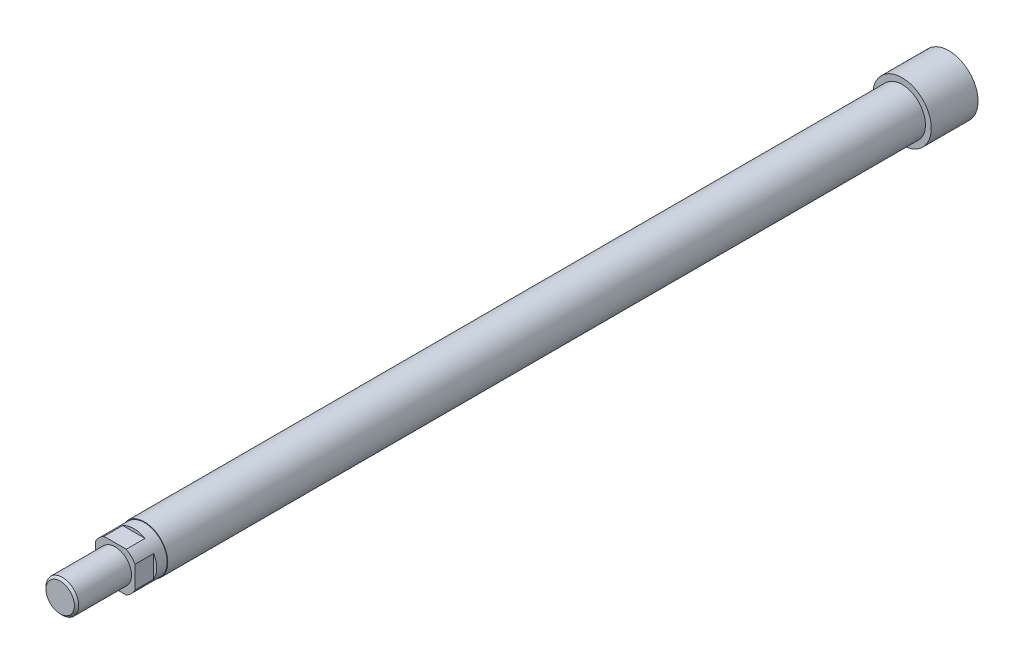
ISO-10303-21;
HEADER;
FILE_DESCRIPTION(('STEP AP214'),'2;1');
FILE_NAME('part.step','',(''),(''),'','','');
FILE_SCHEMA(('AUTOMOTIVE_DESIGN { 1 0 10303 214 1 1 1 1 }'));
ENDSEC;
DATA;
#1=APPLICATION_CONTEXT('core data for automotive mechanical design processes');
#2=APPLICATION_PROTOCOL_DEFINITION('international standard','automotive_design',2000,#1);
#3=PRODUCT_CONTEXT('',#1,'mechanical');
#4=PRODUCT('Part','Part','',(#3));
#5=PRODUCT_RELATED_PRODUCT_CATEGORY('part','',(#4));
#6=PRODUCT_DEFINITION_FORMATION('','',#4);
#7=PRODUCT_DEFINITION_CONTEXT('part definition',#1,'design');
#8=PRODUCT_DEFINITION('design','',#6,#7);
#9=PRODUCT_DEFINITION_SHAPE('','',#8);
#10=(LENGTH_UNIT() NAMED_UNIT(*) SI_UNIT(.MILLI.,.METRE.));
#11=(NAMED_UNIT(*) PLANE_ANGLE_UNIT() SI_UNIT($,.RADIAN.));
#12=(NAMED_UNIT(*) SI_UNIT($,.STERADIAN.) SOLID_ANGLE_UNIT());
#13=UNCERTAINTY_MEASURE_WITH_UNIT(LENGTH_MEASURE(1.E-05),#10,'distance_accuracy_value','');
#14=(GEOMETRIC_REPRESENTATION_CONTEXT(3) GLOBAL_UNCERTAINTY_ASSIGNED_CONTEXT((#13)) GLOBAL_UNIT_ASSIGNED_CONTEXT((#10,
#11,#12)) REPRESENTATION_CONTEXT('',''));
#15=CARTESIAN_POINT('',(0.,0.,0.));
#16=DIRECTION('',(0.,0.,1.));
#17=DIRECTION('',(1.,0.,0.));
#18=AXIS2_PLACEMENT_3D('',#15,#16,#17);
#19=CARTESIAN_POINT('',(0.,0.,-322.));
#20=DIRECTION('',(0.,0.,-1.));
#21=DIRECTION('',(-1.,0.,0.));
#22=AXIS2_PLACEMENT_3D('',#19,#20,#21);
#23=CYLINDRICAL_SURFACE('',#22,12.5);
#24=CARTESIAN_POINT('',(0.,0.,-322.));
#25=DIRECTION('',(0.,0.,-1.));
#26=DIRECTION('',(-1.,0.,0.));
#27=AXIS2_PLACEMENT_3D('',#24,#25,#26);
#28=CIRCLE('',#27,12.5);
#29=CARTESIAN_POINT('',(-12.5,0.,-322.));
#30=VERTEX_POINT('',#29);
#31=EDGE_CURVE('E176',#30,#30,#28,.T.);
#32=ORIENTED_EDGE('',*,*,#31,.T.);
#33=EDGE_LOOP('',(#32));
#34=FACE_BOUND('',#33,.T.);
#35=CARTESIAN_POINT('',(0.,0.,-342.));
#36=DIRECTION('',(0.,0.,-1.));
#37=DIRECTION('',(-1.,0.,0.));
#38=AXIS2_PLACEMENT_3D('',#35,#36,#37);
#39=CIRCLE('',#38,12.5);
#40=CARTESIAN_POINT('',(-12.5,0.,-342.));
#41=VERTEX_POINT('',#40);
#42=EDGE_CURVE('E173',#41,#41,#39,.T.);
#43=ORIENTED_EDGE('',*,*,#42,.F.);
#44=EDGE_LOOP('',(#43));
#45=FACE_BOUND('',#44,.T.);
#46=ADVANCED_FACE('F39',(#34,#45),#23,.T.);
#47=CARTESIAN_POINT('',(12.5,0.,-322.));
#48=DIRECTION('',(0.,0.,1.));
#49=DIRECTION('',(1.,0.,0.));
#50=AXIS2_PLACEMENT_3D('',#47,#48,#49);
#51=PLANE('',#50);
#52=CARTESIAN_POINT('',(0.,0.,-322.));
#53=DIRECTION('',(0.,0.,1.));
#54=DIRECTION('',(1.,0.,0.));
#55=AXIS2_PLACEMENT_3D('',#52,#53,#54);
#56=CIRCLE('',#55,10.);
#57=CARTESIAN_POINT('',(10.,0.,-322.));
#58=VERTEX_POINT('',#57);
#59=EDGE_CURVE('E170',#58,#58,#56,.T.);
#60=ORIENTED_EDGE('',*,*,#59,.F.);
#61=EDGE_LOOP('',(#60));
#62=FACE_BOUND('',#61,.T.);
#63=ORIENTED_EDGE('',*,*,#31,.F.);
#64=EDGE_LOOP('',(#63));
#65=FACE_BOUND('',#64,.T.);
#66=ADVANCED_FACE('F214',(#62,#65),#51,.T.);
#67=CARTESIAN_POINT('',(0.,0.,-342.));
#68=DIRECTION('',(0.,0.,-1.));
#69=DIRECTION('',(-1.,0.,0.));
#70=AXIS2_PLACEMENT_3D('',#67,#68,#69);
#71=PLANE('',#70);
#72=ORIENTED_EDGE('',*,*,#42,.T.);
#73=EDGE_LOOP('',(#72));
#74=FACE_BOUND('',#73,.T.);
#75=ADVANCED_FACE('F219',(#74),#71,.T.);
#76=CARTESIAN_POINT('',(0.,0.,2.));
#77=DIRECTION('',(0.,0.,-1.));
#78=DIRECTION('',(-1.,0.,0.));
#79=AXIS2_PLACEMENT_3D('',#76,#77,#78);
#80=CYLINDRICAL_SURFACE('',#79,10.);
#81=CARTESIAN_POINT('',(0.,0.,2.));
#82=DIRECTION('',(0.,0.,1.));
#83=DIRECTION('',(1.,0.,0.));
#84=AXIS2_PLACEMENT_3D('',#81,#82,#83);
#85=CIRCLE('',#84,10.);
#86=CARTESIAN_POINT('',(10.,0.,2.));
#87=VERTEX_POINT('',#86);
#88=EDGE_CURVE('E164',#87,#87,#85,.T.);
#89=ORIENTED_EDGE('',*,*,#88,.F.);
#90=EDGE_LOOP('',(#89));
#91=FACE_BOUND('',#90,.T.);
#92=ORIENTED_EDGE('',*,*,#59,.T.);
#93=EDGE_LOOP('',(#92));
#94=FACE_BOUND('',#93,.T.);
#95=ADVANCED_FACE('F226',(#91,#94),#80,.T.);
#96=CARTESIAN_POINT('',(0.,0.,2.));
#97=DIRECTION('',(0.,0.,1.));
#98=DIRECTION('',(1.,0.,0.));
#99=AXIS2_PLACEMENT_3D('',#96,#97,#98);
#100=PLANE('',#99);
#101=CARTESIAN_POINT('',(0.,0.,2.));
#102=DIRECTION('',(0.,0.,1.));
#103=DIRECTION('',(1.,0.,0.));
#104=AXIS2_PLACEMENT_3D('',#101,#102,#103);
#105=CIRCLE('',#104,9.75);
#106=CARTESIAN_POINT('',(9.75,0.,2.));
#107=VERTEX_POINT('',#106);
#108=EDGE_CURVE('E166',#107,#107,#105,.T.);
#109=ORIENTED_EDGE('',*,*,#108,.F.);
#110=EDGE_LOOP('',(#109));
#111=FACE_BOUND('',#110,.T.);
#112=ORIENTED_EDGE('',*,*,#88,.T.);
#113=EDGE_LOOP('',(#112));
#114=FACE_BOUND('',#113,.T.);
#115=ADVANCED_FACE('F230',(#111,#114),#100,.T.);
#116=CARTESIAN_POINT('',(0.,0.,14.5));
#117=DIRECTION('',(0.,0.,-1.));
#118=DIRECTION('',(-1.,0.,0.));
#119=AXIS2_PLACEMENT_3D('',#116,#117,#118);
#120=CYLINDRICAL_SURFACE('',#119,9.75);
#121=CARTESIAN_POINT('',(0.,0.,14.5));
#122=DIRECTION('',(0.,0.,1.));
#123=DIRECTION('',(1.,0.,0.));
#124=AXIS2_PLACEMENT_3D('',#121,#122,#123);
#125=CIRCLE('',#124,9.75);
#126=CARTESIAN_POINT('',(-4.7762432936357,8.5,14.5));
#127=VERTEX_POINT('',#126);
#128=CARTESIAN_POINT('',(-8.5,4.7762432936357,14.5));
#129=VERTEX_POINT('',#128);
#130=EDGE_CURVE('E121',#127,#129,#125,.T.);
#131=ORIENTED_EDGE('',*,*,#130,.F.);
#132=DIRECTION('',(0.,0.,1.));
#133=VECTOR('',#132,1.);
#134=CARTESIAN_POINT('',(-4.7762432936357,8.5,6.5));
#135=LINE('',#134,#133);
#136=CARTESIAN_POINT('',(-4.7762432936357,8.5,6.5));
#137=VERTEX_POINT('',#136);
#138=EDGE_CURVE('E55',#137,#127,#135,.T.);
#139=ORIENTED_EDGE('',*,*,#138,.F.);
#140=CARTESIAN_POINT('',(0.,0.,6.5));
#141=DIRECTION('',(0.,0.,1.));
#142=DIRECTION('',(1.,0.,0.));
#143=AXIS2_PLACEMENT_3D('',#140,#141,#142);
#144=CIRCLE('',#143,9.75);
#145=CARTESIAN_POINT('',(4.7762432936357,8.5,6.5));
#146=VERTEX_POINT('',#145);
#147=EDGE_CURVE('E107',#146,#137,#144,.T.);
#148=ORIENTED_EDGE('',*,*,#147,.F.);
#149=DIRECTION('',(0.,0.,1.));
#150=VECTOR('',#149,1.);
#151=CARTESIAN_POINT('',(4.7762432936357,8.5,6.5));
#152=LINE('',#151,#150);
#153=CARTESIAN_POINT('',(4.7762432936357,8.5,14.5));
#154=VERTEX_POINT('',#153);
#155=EDGE_CURVE('E115',#146,#154,#152,.T.);
#156=ORIENTED_EDGE('',*,*,#155,.T.);
#157=CARTESIAN_POINT('',(8.5,4.7762432936357,14.5));
#158=VERTEX_POINT('',#157);
#159=EDGE_CURVE('E190',#158,#154,#125,.T.);
#160=ORIENTED_EDGE('',*,*,#159,.F.);
#161=DIRECTION('',(0.,0.,1.));
#162=VECTOR('',#161,1.);
#163=CARTESIAN_POINT('',(8.5,4.7762432936357,6.5));
#164=LINE('',#163,#162);
#165=CARTESIAN_POINT('',(8.5,4.7762432936357,6.5));
#166=VERTEX_POINT('',#165);
#167=EDGE_CURVE('E63',#166,#158,#164,.T.);
#168=ORIENTED_EDGE('',*,*,#167,.F.);
#169=CARTESIAN_POINT('',(0.,0.,6.5));
#170=DIRECTION('',(0.,0.,1.));
#171=DIRECTION('',(1.,0.,0.));
#172=AXIS2_PLACEMENT_3D('',#169,#170,#171);
#173=CIRCLE('',#172,9.75);
#174=CARTESIAN_POINT('',(8.5,-4.7762432936357,6.5));
#175=VERTEX_POINT('',#174);
#176=EDGE_CURVE('E127',#175,#166,#173,.T.);
#177=ORIENTED_EDGE('',*,*,#176,.F.);
#178=DIRECTION('',(0.,0.,1.));
#179=VECTOR('',#178,1.);
#180=CARTESIAN_POINT('',(8.5,-4.7762432936357,6.5));
#181=LINE('',#180,#179);
#182=CARTESIAN_POINT('',(8.5,-4.7762432936357,14.5));
#183=VERTEX_POINT('',#182);
#184=EDGE_CURVE('E133',#175,#183,#181,.T.);
#185=ORIENTED_EDGE('',*,*,#184,.T.);
#186=CARTESIAN_POINT('',(4.7762432936357,-8.5,14.5));
#187=VERTEX_POINT('',#186);
#188=EDGE_CURVE('E165',#187,#183,#125,.T.);
#189=ORIENTED_EDGE('',*,*,#188,.F.);
#190=DIRECTION('',(0.,0.,1.));
#191=VECTOR('',#190,1.);
#192=CARTESIAN_POINT('',(4.7762432936357,-8.5,6.5));
#193=LINE('',#192,#191);
#194=CARTESIAN_POINT('',(4.7762432936357,-8.5,6.5));
#195=VERTEX_POINT('',#194);
#196=EDGE_CURVE('E143',#195,#187,#193,.T.);
#197=ORIENTED_EDGE('',*,*,#196,.F.);
#198=CARTESIAN_POINT('',(0.,0.,6.5));
#199=DIRECTION('',(0.,0.,1.));
#200=DIRECTION('',(1.,0.,0.));
#201=AXIS2_PLACEMENT_3D('',#198,#199,#200);
#202=CIRCLE('',#201,9.75);
#203=CARTESIAN_POINT('',(-4.7762432936357,-8.5,6.5));
#204=VERTEX_POINT('',#203);
#205=EDGE_CURVE('E138',#204,#195,#202,.T.);
#206=ORIENTED_EDGE('',*,*,#205,.F.);
#207=DIRECTION('',(0.,0.,1.));
#208=VECTOR('',#207,1.);
#209=CARTESIAN_POINT('',(-4.7762432936357,-8.5,6.5));
#210=LINE('',#209,#208);
#211=CARTESIAN_POINT('',(-4.7762432936357,-8.5,14.5));
#212=VERTEX_POINT('',#211);
#213=EDGE_CURVE('E145',#204,#212,#210,.T.);
#214=ORIENTED_EDGE('',*,*,#213,.T.);
#215=CARTESIAN_POINT('',(-8.5,-4.7762432936357,14.5));
#216=VERTEX_POINT('',#215);
#217=EDGE_CURVE('E161',#216,#212,#125,.T.);
#218=ORIENTED_EDGE('',*,*,#217,.F.);
#219=DIRECTION('',(0.,0.,1.));
#220=VECTOR('',#219,1.);
#221=CARTESIAN_POINT('',(-8.5,-4.7762432936357,6.5));
#222=LINE('',#221,#220);
#223=CARTESIAN_POINT('',(-8.5,-4.7762432936357,6.5));
#224=VERTEX_POINT('',#223);
#225=EDGE_CURVE('E155',#224,#216,#222,.T.);
#226=ORIENTED_EDGE('',*,*,#225,.F.);
#227=CARTESIAN_POINT('',(0.,0.,6.5));
#228=DIRECTION('',(0.,0.,1.));
#229=DIRECTION('',(1.,0.,0.));
#230=AXIS2_PLACEMENT_3D('',#227,#228,#229);
#231=CIRCLE('',#230,9.75);
#232=CARTESIAN_POINT('',(-8.5,4.7762432936357,6.5));
#233=VERTEX_POINT('',#232);
#234=EDGE_CURVE('E150',#233,#224,#231,.T.);
#235=ORIENTED_EDGE('',*,*,#234,.F.);
#236=DIRECTION('',(0.,0.,1.));
#237=VECTOR('',#236,1.);
#238=CARTESIAN_POINT('',(-8.5,4.7762432936357,6.5));
#239=LINE('',#238,#237);
#240=EDGE_CURVE('E158',#233,#129,#239,.T.);
#241=ORIENTED_EDGE('',*,*,#240,.T.);
#242=EDGE_LOOP('',(#131,#139,#148,#156,#160,#168,#177,#185,#189,#197,#206,#214,#218,#226,#235,#241));
#243=FACE_BOUND('',#242,.T.);
#244=ORIENTED_EDGE('',*,*,#108,.T.);
#245=EDGE_LOOP('',(#244));
#246=FACE_BOUND('',#245,.T.);
#247=ADVANCED_FACE('F118',(#243,#246),#120,.T.);
#248=CARTESIAN_POINT('',(0.,0.,14.5));
#249=DIRECTION('',(0.,0.,1.));
#250=DIRECTION('',(1.,0.,0.));
#251=AXIS2_PLACEMENT_3D('',#248,#249,#250);
#252=PLANE('',#251);
#253=CARTESIAN_POINT('',(0.,0.,14.5));
#254=DIRECTION('',(0.,0.,1.));
#255=DIRECTION('',(1.,0.,0.));
#256=AXIS2_PLACEMENT_3D('',#253,#254,#255);
#257=CIRCLE('',#256,6.9999999999999);
#258=CARTESIAN_POINT('',(6.9999999999999,0.,14.5));
#259=VERTEX_POINT('',#258);
#260=EDGE_CURVE('E169',#259,#259,#257,.T.);
#261=ORIENTED_EDGE('',*,*,#260,.F.);
#262=EDGE_LOOP('',(#261));
#263=FACE_BOUND('',#262,.T.);
#264=DIRECTION('',(1.,0.,0.));
#265=VECTOR('',#264,1.);
#266=CARTESIAN_POINT('',(-4.7762432936357,8.5,14.5));
#267=LINE('',#266,#265);
#268=EDGE_CURVE('E112',#127,#154,#267,.T.);
#269=ORIENTED_EDGE('',*,*,#268,.F.);
#270=ORIENTED_EDGE('',*,*,#130,.T.);
#271=DIRECTION('',(0.,1.,0.));
#272=VECTOR('',#271,1.);
#273=CARTESIAN_POINT('',(-8.5,-4.7762432936357,14.5));
#274=LINE('',#273,#272);
#275=EDGE_CURVE('E148',#216,#129,#274,.T.);
#276=ORIENTED_EDGE('',*,*,#275,.F.);
#277=ORIENTED_EDGE('',*,*,#217,.T.);
#278=DIRECTION('',(-1.,0.,0.));
#279=VECTOR('',#278,1.);
#280=CARTESIAN_POINT('',(4.7762432936357,-8.5,14.5));
#281=LINE('',#280,#279);
#282=EDGE_CURVE('E136',#187,#212,#281,.T.);
#283=ORIENTED_EDGE('',*,*,#282,.F.);
#284=ORIENTED_EDGE('',*,*,#188,.T.);
#285=DIRECTION('',(0.,-1.,0.));
#286=VECTOR('',#285,1.);
#287=CARTESIAN_POINT('',(8.5,4.7762432936357,14.5));
#288=LINE('',#287,#286);
#289=EDGE_CURVE('E123',#158,#183,#288,.T.);
#290=ORIENTED_EDGE('',*,*,#289,.F.);
#291=ORIENTED_EDGE('',*,*,#159,.T.);
#292=EDGE_LOOP('',(#269,#270,#276,#277,#283,#284,#290,#291));
#293=FACE_BOUND('',#292,.T.);
#294=ADVANCED_FACE('F191',(#263,#293),#252,.T.);
#295=CARTESIAN_POINT('',(-8.5,-4.7762432936357,6.5));
#296=DIRECTION('',(1.,0.,0.));
#297=DIRECTION('',(0.,0.,-1.));
#298=AXIS2_PLACEMENT_3D('',#295,#296,#297);
#299=PLANE('',#298);
#300=ORIENTED_EDGE('',*,*,#275,.T.);
#301=ORIENTED_EDGE('',*,*,#240,.F.);
#302=DIRECTION('',(0.,1.,0.));
#303=VECTOR('',#302,1.);
#304=CARTESIAN_POINT('',(-8.5,-4.7762432936357,6.5));
#305=LINE('',#304,#303);
#306=EDGE_CURVE('E152',#224,#233,#305,.T.);
#307=ORIENTED_EDGE('',*,*,#306,.F.);
#308=ORIENTED_EDGE('',*,*,#225,.T.);
#309=EDGE_LOOP('',(#300,#301,#307,#308));
#310=FACE_BOUND('',#309,.T.);
#311=ADVANCED_FACE('F196',(#310),#299,.F.);
#312=CARTESIAN_POINT('',(0.,0.,6.5));
#313=DIRECTION('',(0.,0.,1.));
#314=DIRECTION('',(1.,0.,0.));
#315=AXIS2_PLACEMENT_3D('',#312,#313,#314);
#316=PLANE('',#315);
#317=ORIENTED_EDGE('',*,*,#234,.T.);
#318=ORIENTED_EDGE('',*,*,#306,.T.);
#319=EDGE_LOOP('',(#317,#318));
#320=FACE_BOUND('',#319,.T.);
#321=ADVANCED_FACE('F201',(#320),#316,.T.);
#322=CARTESIAN_POINT('',(4.7762432936357,-8.5,6.5));
#323=DIRECTION('',(0.,1.,0.));
#324=DIRECTION('',(0.,0.,1.));
#325=AXIS2_PLACEMENT_3D('',#322,#323,#324);
#326=PLANE('',#325);
#327=ORIENTED_EDGE('',*,*,#282,.T.);
#328=ORIENTED_EDGE('',*,*,#213,.F.);
#329=DIRECTION('',(-1.,0.,0.));
#330=VECTOR('',#329,1.);
#331=CARTESIAN_POINT('',(4.7762432936357,-8.5,6.5));
#332=LINE('',#331,#330);
#333=EDGE_CURVE('E140',#195,#204,#332,.T.);
#334=ORIENTED_EDGE('',*,*,#333,.F.);
#335=ORIENTED_EDGE('',*,*,#196,.T.);
#336=EDGE_LOOP('',(#327,#328,#334,#335));
#337=FACE_BOUND('',#336,.T.);
#338=ADVANCED_FACE('F203',(#337),#326,.F.);
#339=CARTESIAN_POINT('',(0.,0.,6.5));
#340=DIRECTION('',(0.,0.,1.));
#341=DIRECTION('',(1.,0.,0.));
#342=AXIS2_PLACEMENT_3D('',#339,#340,#341);
#343=PLANE('',#342);
#344=ORIENTED_EDGE('',*,*,#205,.T.);
#345=ORIENTED_EDGE('',*,*,#333,.T.);
#346=EDGE_LOOP('',(#344,#345));
#347=FACE_BOUND('',#346,.T.);
#348=ADVANCED_FACE('F209',(#347),#343,.T.);
#349=CARTESIAN_POINT('',(8.5,4.7762432936357,6.5));
#350=DIRECTION('',(-1.,0.,0.));
#351=DIRECTION('',(0.,0.,1.));
#352=AXIS2_PLACEMENT_3D('',#349,#350,#351);
#353=PLANE('',#352);
#354=ORIENTED_EDGE('',*,*,#289,.T.);
#355=ORIENTED_EDGE('',*,*,#184,.F.);
#356=DIRECTION('',(0.,-1.,0.));
#357=VECTOR('',#356,1.);
#358=CARTESIAN_POINT('',(8.5,4.7762432936357,6.5));
#359=LINE('',#358,#357);
#360=EDGE_CURVE('E129',#166,#175,#359,.T.);
#361=ORIENTED_EDGE('',*,*,#360,.F.);
#362=ORIENTED_EDGE('',*,*,#167,.T.);
#363=EDGE_LOOP('',(#354,#355,#361,#362));
#364=FACE_BOUND('',#363,.T.);
#365=ADVANCED_FACE('F272',(#364),#353,.F.);
#366=CARTESIAN_POINT('',(0.,0.,6.5));
#367=DIRECTION('',(0.,0.,1.));
#368=DIRECTION('',(1.,0.,0.));
#369=AXIS2_PLACEMENT_3D('',#366,#367,#368);
#370=PLANE('',#369);
#371=ORIENTED_EDGE('',*,*,#176,.T.);
#372=ORIENTED_EDGE('',*,*,#360,.T.);
#373=EDGE_LOOP('',(#371,#372));
#374=FACE_BOUND('',#373,.T.);
#375=ADVANCED_FACE('F282',(#374),#370,.T.);
#376=CARTESIAN_POINT('',(-4.7762432936357,8.5,6.5));
#377=DIRECTION('',(0.,-1.,0.));
#378=DIRECTION('',(0.,0.,-1.));
#379=AXIS2_PLACEMENT_3D('',#376,#377,#378);
#380=PLANE('',#379);
#381=ORIENTED_EDGE('',*,*,#268,.T.);
#382=ORIENTED_EDGE('',*,*,#155,.F.);
#383=DIRECTION('',(1.,0.,0.));
#384=VECTOR('',#383,1.);
#385=CARTESIAN_POINT('',(-4.7762432936357,8.5,6.5));
#386=LINE('',#385,#384);
#387=EDGE_CURVE('E109',#137,#146,#386,.T.);
#388=ORIENTED_EDGE('',*,*,#387,.F.);
#389=ORIENTED_EDGE('',*,*,#138,.T.);
#390=EDGE_LOOP('',(#381,#382,#388,#389));
#391=FACE_BOUND('',#390,.T.);
#392=ADVANCED_FACE('F114',(#391),#380,.F.);
#393=CARTESIAN_POINT('',(0.,0.,6.5));
#394=DIRECTION('',(0.,0.,1.));
#395=DIRECTION('',(1.,0.,0.));
#396=AXIS2_PLACEMENT_3D('',#393,#394,#395);
#397=PLANE('',#396);
#398=ORIENTED_EDGE('',*,*,#147,.T.);
#399=ORIENTED_EDGE('',*,*,#387,.T.);
#400=EDGE_LOOP('',(#398,#399));
#401=FACE_BOUND('',#400,.T.);
#402=ADVANCED_FACE('F108',(#401),#397,.T.);
#403=CARTESIAN_POINT('',(0.,0.,38.));
#404=DIRECTION('',(0.,0.,-1.));
#405=DIRECTION('',(-1.,0.,0.));
#406=AXIS2_PLACEMENT_3D('',#403,#404,#405);
#407=CYLINDRICAL_SURFACE('',#406,6.9999999999999);
#408=CARTESIAN_POINT('',(0.,0.,37.0800000000001));
#409=DIRECTION('',(0.,0.,1.));
#410=DIRECTION('',(1.,0.,0.));
#411=AXIS2_PLACEMENT_3D('',#408,#409,#410);
#412=CIRCLE('',#411,6.9999999999999);
#413=CARTESIAN_POINT('',(6.9999999999999,0.,37.0800000000001));
#414=VERTEX_POINT('',#413);
#415=EDGE_CURVE('E11',#414,#414,#412,.F.);
#416=ORIENTED_EDGE('',*,*,#415,.T.);
#417=EDGE_LOOP('',(#416));
#418=FACE_BOUND('',#417,.T.);
#419=ORIENTED_EDGE('',*,*,#260,.T.);
#420=EDGE_LOOP('',(#419));
#421=FACE_BOUND('',#420,.T.);
#422=ADVANCED_FACE('F310',(#418,#421),#407,.T.);
#423=CARTESIAN_POINT('',(0.,0.,38.));
#424=DIRECTION('',(0.,0.,1.));
#425=DIRECTION('',(1.,0.,0.));
#426=AXIS2_PLACEMENT_3D('',#423,#424,#425);
#427=PLANE('',#426);
#428=CARTESIAN_POINT('',(0.,0.,38.));
#429=DIRECTION('',(0.,0.,1.));
#430=DIRECTION('',(1.,0.,0.));
#431=AXIS2_PLACEMENT_3D('',#428,#429,#430);
#432=CIRCLE('',#431,6.08000000000003);
#433=CARTESIAN_POINT('',(6.08000000000003,0.,38.));
#434=VERTEX_POINT('',#433);
#435=EDGE_CURVE('E48',#434,#434,#432,.T.);
#436=ORIENTED_EDGE('',*,*,#435,.T.);
#437=EDGE_LOOP('',(#436));
#438=FACE_BOUND('',#437,.T.);
#439=ADVANCED_FACE('F319',(#438),#427,.T.);
#440=CARTESIAN_POINT('',(0.,0.,38.));
#441=DIRECTION('',(0.,0.,-1.));
#442=DIRECTION('',(-1.,0.,0.));
#443=AXIS2_PLACEMENT_3D('',#440,#441,#442);
#444=CONICAL_SURFACE('',#443,6.08000000000003,0.785398163397436);
#445=ORIENTED_EDGE('',*,*,#415,.F.);
#446=EDGE_LOOP('',(#445));
#447=FACE_BOUND('',#446,.T.);
#448=ORIENTED_EDGE('',*,*,#435,.F.);
#449=EDGE_LOOP('',(#448));
#450=FACE_BOUND('',#449,.T.);
#451=ADVANCED_FACE('F42',(#447,#450),#444,.T.);
#452=CLOSED_SHELL('',(#46,#66,#75,#95,#115,#247,#294,#311,#321,#338,#348,#365,#375,#392,#402,
#422,#439,#451));
#453=MANIFOLD_SOLID_BREP('B2',#452);
#454=ADVANCED_BREP_SHAPE_REPRESENTATION('',(#18,#453),#14);
#455=SHAPE_DEFINITION_REPRESENTATION(#9,#454);
ENDSEC;
END-ISO-10303-21;
